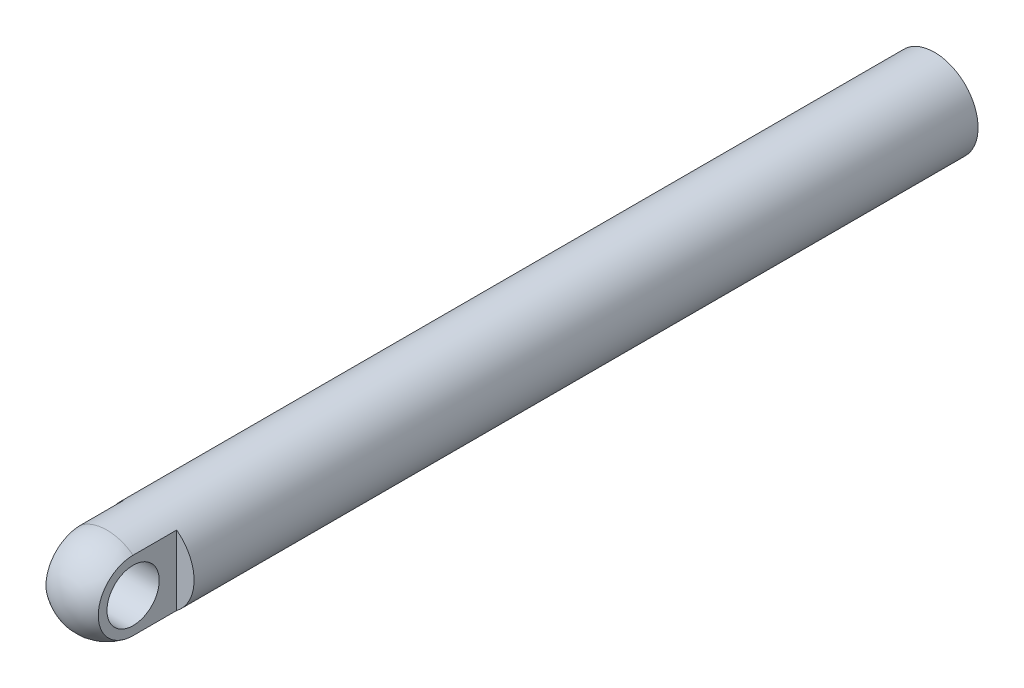
ISO-10303-21;
HEADER;
FILE_DESCRIPTION(('STEP AP214'),'2;1');
FILE_NAME('part.step','',(''),(''),'','','');
FILE_SCHEMA(('AUTOMOTIVE_DESIGN { 1 0 10303 214 1 1 1 1 }'));
ENDSEC;
DATA;
#1=APPLICATION_CONTEXT('core data for automotive mechanical design processes');
#2=APPLICATION_PROTOCOL_DEFINITION('international standard','automotive_design',2000,#1);
#3=PRODUCT_CONTEXT('',#1,'mechanical');
#4=PRODUCT('Part','Part','',(#3));
#5=PRODUCT_RELATED_PRODUCT_CATEGORY('part','',(#4));
#6=PRODUCT_DEFINITION_FORMATION('','',#4);
#7=PRODUCT_DEFINITION_CONTEXT('part definition',#1,'design');
#8=PRODUCT_DEFINITION('design','',#6,#7);
#9=PRODUCT_DEFINITION_SHAPE('','',#8);
#10=(LENGTH_UNIT() NAMED_UNIT(*) SI_UNIT(.MILLI.,.METRE.));
#11=(NAMED_UNIT(*) PLANE_ANGLE_UNIT() SI_UNIT($,.RADIAN.));
#12=(NAMED_UNIT(*) SI_UNIT($,.STERADIAN.) SOLID_ANGLE_UNIT());
#13=UNCERTAINTY_MEASURE_WITH_UNIT(LENGTH_MEASURE(1.E-05),#10,'distance_accuracy_value','');
#14=(GEOMETRIC_REPRESENTATION_CONTEXT(3) GLOBAL_UNCERTAINTY_ASSIGNED_CONTEXT((#13)) GLOBAL_UNIT_ASSIGNED_CONTEXT((#10,
#11,#12)) REPRESENTATION_CONTEXT('',''));
#15=CARTESIAN_POINT('',(0.,0.,0.));
#16=DIRECTION('',(0.,0.,1.));
#17=DIRECTION('',(1.,0.,0.));
#18=AXIS2_PLACEMENT_3D('',#15,#16,#17);
#19=CARTESIAN_POINT('',(0.,0.,396.75));
#20=DIRECTION('',(0.,0.,-1.));
#21=DIRECTION('',(-1.,0.,0.));
#22=AXIS2_PLACEMENT_3D('',#19,#20,#21);
#23=CYLINDRICAL_SURFACE('',#22,17.25);
#24=DIRECTION('',(0.,0.,-1.));
#25=VECTOR('',#24,1.);
#26=CARTESIAN_POINT('',(10.35,-13.8,396.75));
#27=LINE('',#26,#25);
#28=CARTESIAN_POINT('',(10.35,-13.8,362.25));
#29=VERTEX_POINT('',#28);
#30=CARTESIAN_POINT('',(10.35,-13.8,379.5));
#31=VERTEX_POINT('',#30);
#32=EDGE_CURVE('E85',#29,#31,#27,.F.);
#33=ORIENTED_EDGE('',*,*,#32,.T.);
#34=CARTESIAN_POINT('',(0.,0.,379.5));
#35=DIRECTION('',(0.,0.,-1.));
#36=DIRECTION('',(-1.,0.,0.));
#37=AXIS2_PLACEMENT_3D('',#34,#35,#36);
#38=CIRCLE('',#37,17.25);
#39=CARTESIAN_POINT('',(-10.35,-13.8,379.5));
#40=VERTEX_POINT('',#39);
#41=EDGE_CURVE('E111',#31,#40,#38,.T.);
#42=ORIENTED_EDGE('',*,*,#41,.T.);
#43=DIRECTION('',(0.,0.,-1.));
#44=VECTOR('',#43,1.);
#45=CARTESIAN_POINT('',(-10.35,-13.8,396.75));
#46=LINE('',#45,#44);
#47=CARTESIAN_POINT('',(-10.35,-13.8,362.25));
#48=VERTEX_POINT('',#47);
#49=EDGE_CURVE('E106',#40,#48,#46,.T.);
#50=ORIENTED_EDGE('',*,*,#49,.T.);
#51=CARTESIAN_POINT('',(0.,0.,362.25));
#52=DIRECTION('',(0.,0.,-1.));
#53=DIRECTION('',(-1.,0.,0.));
#54=AXIS2_PLACEMENT_3D('',#51,#52,#53);
#55=CIRCLE('',#54,17.25);
#56=CARTESIAN_POINT('',(-10.35,13.8,362.25));
#57=VERTEX_POINT('',#56);
#58=EDGE_CURVE('E91',#48,#57,#55,.T.);
#59=ORIENTED_EDGE('',*,*,#58,.T.);
#60=DIRECTION('',(0.,0.,-1.));
#61=VECTOR('',#60,1.);
#62=CARTESIAN_POINT('',(-10.35,13.8,396.75));
#63=LINE('',#62,#61);
#64=CARTESIAN_POINT('',(-10.35,13.8,379.5));
#65=VERTEX_POINT('',#64);
#66=EDGE_CURVE('E104',#57,#65,#63,.F.);
#67=ORIENTED_EDGE('',*,*,#66,.T.);
#68=CARTESIAN_POINT('',(0.,0.,379.5));
#69=DIRECTION('',(0.,0.,-1.));
#70=DIRECTION('',(-1.,0.,0.));
#71=AXIS2_PLACEMENT_3D('',#68,#69,#70);
#72=CIRCLE('',#71,17.25);
#73=CARTESIAN_POINT('',(10.35,13.8,379.5));
#74=VERTEX_POINT('',#73);
#75=EDGE_CURVE('E80',#65,#74,#72,.T.);
#76=ORIENTED_EDGE('',*,*,#75,.T.);
#77=DIRECTION('',(0.,0.,-1.));
#78=VECTOR('',#77,1.);
#79=CARTESIAN_POINT('',(10.35,13.8,396.75));
#80=LINE('',#79,#78);
#81=CARTESIAN_POINT('',(10.35,13.8,362.25));
#82=VERTEX_POINT('',#81);
#83=EDGE_CURVE('E75',#74,#82,#80,.T.);
#84=ORIENTED_EDGE('',*,*,#83,.T.);
#85=CARTESIAN_POINT('',(0.,0.,362.25));
#86=DIRECTION('',(0.,0.,-1.));
#87=DIRECTION('',(-1.,0.,0.));
#88=AXIS2_PLACEMENT_3D('',#85,#86,#87);
#89=CIRCLE('',#88,17.25);
#90=EDGE_CURVE('E79',#82,#29,#89,.T.);
#91=ORIENTED_EDGE('',*,*,#90,.T.);
#92=EDGE_LOOP('',(#33,#42,#50,#59,#67,#76,#84,#91));
#93=FACE_BOUND('',#92,.T.);
#94=CARTESIAN_POINT('',(0.,0.,51.75));
#95=DIRECTION('',(0.,0.,-1.));
#96=DIRECTION('',(-1.,0.,0.));
#97=AXIS2_PLACEMENT_3D('',#94,#95,#96);
#98=CIRCLE('',#97,17.25);
#99=CARTESIAN_POINT('',(-17.25,0.,51.75));
#100=VERTEX_POINT('',#99);
#101=EDGE_CURVE('E39',#100,#100,#98,.T.);
#102=ORIENTED_EDGE('',*,*,#101,.F.);
#103=EDGE_LOOP('',(#102));
#104=FACE_BOUND('',#103,.T.);
#105=ADVANCED_FACE('F35',(#93,#104),#23,.T.);
#106=CARTESIAN_POINT('',(0.,0.,362.25));
#107=DIRECTION('',(0.,0.,-1.));
#108=DIRECTION('',(-1.,0.,0.));
#109=AXIS2_PLACEMENT_3D('',#106,#107,#108);
#110=PLANE('',#109);
#111=DIRECTION('',(0.,1.,0.));
#112=VECTOR('',#111,1.);
#113=CARTESIAN_POINT('',(-10.35,17.25,362.25));
#114=LINE('',#113,#112);
#115=EDGE_CURVE('E84',#48,#57,#114,.T.);
#116=ORIENTED_EDGE('',*,*,#115,.T.);
#117=ORIENTED_EDGE('',*,*,#58,.F.);
#118=EDGE_LOOP('',(#116,#117));
#119=FACE_BOUND('',#118,.T.);
#120=ADVANCED_FACE('F117',(#119),#110,.F.);
#121=CARTESIAN_POINT('',(-10.35,17.25,362.25));
#122=DIRECTION('',(1.,0.,0.));
#123=DIRECTION('',(0.,0.,-1.));
#124=AXIS2_PLACEMENT_3D('',#121,#122,#123);
#125=PLANE('',#124);
#126=CARTESIAN_POINT('',(-10.35,0.,379.5));
#127=DIRECTION('',(1.,0.,0.));
#128=DIRECTION('',(0.,0.,-1.));
#129=AXIS2_PLACEMENT_3D('',#126,#127,#128);
#130=CIRCLE('',#129,10.35);
#131=CARTESIAN_POINT('',(-10.35,0.,369.15));
#132=VERTEX_POINT('',#131);
#133=EDGE_CURVE('E94',#132,#132,#130,.T.);
#134=ORIENTED_EDGE('',*,*,#133,.T.);
#135=EDGE_LOOP('',(#134));
#136=FACE_BOUND('',#135,.T.);
#137=ORIENTED_EDGE('',*,*,#49,.F.);
#138=CARTESIAN_POINT('',(-10.35,0.,379.5));
#139=DIRECTION('',(1.,0.,0.));
#140=DIRECTION('',(0.,0.,-1.));
#141=AXIS2_PLACEMENT_3D('',#138,#139,#140);
#142=CIRCLE('',#141,13.8);
#143=EDGE_CURVE('E44',#40,#65,#142,.F.);
#144=ORIENTED_EDGE('',*,*,#143,.T.);
#145=ORIENTED_EDGE('',*,*,#66,.F.);
#146=ORIENTED_EDGE('',*,*,#115,.F.);
#147=EDGE_LOOP('',(#137,#144,#145,#146));
#148=FACE_BOUND('',#147,.T.);
#149=ADVANCED_FACE('F115',(#136,#148),#125,.F.);
#150=CARTESIAN_POINT('',(0.,0.,362.25));
#151=DIRECTION('',(0.,0.,-1.));
#152=DIRECTION('',(-1.,0.,0.));
#153=AXIS2_PLACEMENT_3D('',#150,#151,#152);
#154=PLANE('',#153);
#155=DIRECTION('',(0.,-1.,0.));
#156=VECTOR('',#155,1.);
#157=CARTESIAN_POINT('',(10.35,17.25,362.25));
#158=LINE('',#157,#156);
#159=EDGE_CURVE('E90',#82,#29,#158,.T.);
#160=ORIENTED_EDGE('',*,*,#159,.T.);
#161=ORIENTED_EDGE('',*,*,#90,.F.);
#162=EDGE_LOOP('',(#160,#161));
#163=FACE_BOUND('',#162,.T.);
#164=ADVANCED_FACE('F89',(#163),#154,.F.);
#165=CARTESIAN_POINT('',(10.35,17.25,362.25));
#166=DIRECTION('',(-1.,0.,0.));
#167=DIRECTION('',(0.,0.,1.));
#168=AXIS2_PLACEMENT_3D('',#165,#166,#167);
#169=PLANE('',#168);
#170=CARTESIAN_POINT('',(10.35,0.,379.5));
#171=DIRECTION('',(1.,0.,0.));
#172=DIRECTION('',(0.,0.,-1.));
#173=AXIS2_PLACEMENT_3D('',#170,#171,#172);
#174=CIRCLE('',#173,10.35);
#175=CARTESIAN_POINT('',(10.35,0.,369.15));
#176=VERTEX_POINT('',#175);
#177=EDGE_CURVE('E98',#176,#176,#174,.T.);
#178=ORIENTED_EDGE('',*,*,#177,.F.);
#179=EDGE_LOOP('',(#178));
#180=FACE_BOUND('',#179,.T.);
#181=ORIENTED_EDGE('',*,*,#83,.F.);
#182=CARTESIAN_POINT('',(10.35,0.,379.5));
#183=DIRECTION('',(-1.,0.,0.));
#184=DIRECTION('',(0.,0.,1.));
#185=AXIS2_PLACEMENT_3D('',#182,#183,#184);
#186=CIRCLE('',#185,13.8);
#187=EDGE_CURVE('E11',#74,#31,#186,.F.);
#188=ORIENTED_EDGE('',*,*,#187,.T.);
#189=ORIENTED_EDGE('',*,*,#32,.F.);
#190=ORIENTED_EDGE('',*,*,#159,.F.);
#191=EDGE_LOOP('',(#181,#188,#189,#190));
#192=FACE_BOUND('',#191,.T.);
#193=ADVANCED_FACE('F93',(#180,#192),#169,.F.);
#194=CARTESIAN_POINT('',(-24.15,0.,379.5));
#195=DIRECTION('',(1.,0.,0.));
#196=DIRECTION('',(0.,0.,-1.));
#197=AXIS2_PLACEMENT_3D('',#194,#195,#196);
#198=CYLINDRICAL_SURFACE('',#197,10.35);
#199=ORIENTED_EDGE('',*,*,#177,.T.);
#200=EDGE_LOOP('',(#199));
#201=FACE_BOUND('',#200,.T.);
#202=ORIENTED_EDGE('',*,*,#133,.F.);
#203=EDGE_LOOP('',(#202));
#204=FACE_BOUND('',#203,.T.);
#205=ADVANCED_FACE('F120',(#201,#204),#198,.F.);
#206=CARTESIAN_POINT('',(0.,0.,379.5));
#207=DIRECTION('',(0.,0.,1.));
#208=DIRECTION('',(1.,0.,0.));
#209=AXIS2_PLACEMENT_3D('',#206,#207,#208);
#210=SPHERICAL_SURFACE('',#209,17.25);
#211=ORIENTED_EDGE('',*,*,#143,.F.);
#212=ORIENTED_EDGE('',*,*,#41,.F.);
#213=ORIENTED_EDGE('',*,*,#187,.F.);
#214=ORIENTED_EDGE('',*,*,#75,.F.);
#215=EDGE_LOOP('',(#211,#212,#213,#214));
#216=FACE_BOUND('',#215,.T.);
#217=ADVANCED_FACE('F37',(#216),#210,.T.);
#218=CARTESIAN_POINT('',(0.,0.,51.75));
#219=DIRECTION('',(0.,0.,-1.));
#220=DIRECTION('',(-1.,0.,0.));
#221=AXIS2_PLACEMENT_3D('',#218,#219,#220);
#222=PLANE('',#221);
#223=ORIENTED_EDGE('',*,*,#101,.T.);
#224=EDGE_LOOP('',(#223));
#225=FACE_BOUND('',#224,.T.);
#226=ADVANCED_FACE('F119',(#225),#222,.T.);
#227=CLOSED_SHELL('',(#105,#120,#149,#164,#193,#205,#217,#226));
#228=MANIFOLD_SOLID_BREP('B2',#227);
#229=ADVANCED_BREP_SHAPE_REPRESENTATION('',(#18,#228),#14);
#230=SHAPE_DEFINITION_REPRESENTATION(#9,#229);
ENDSEC;
END-ISO-10303-21;
